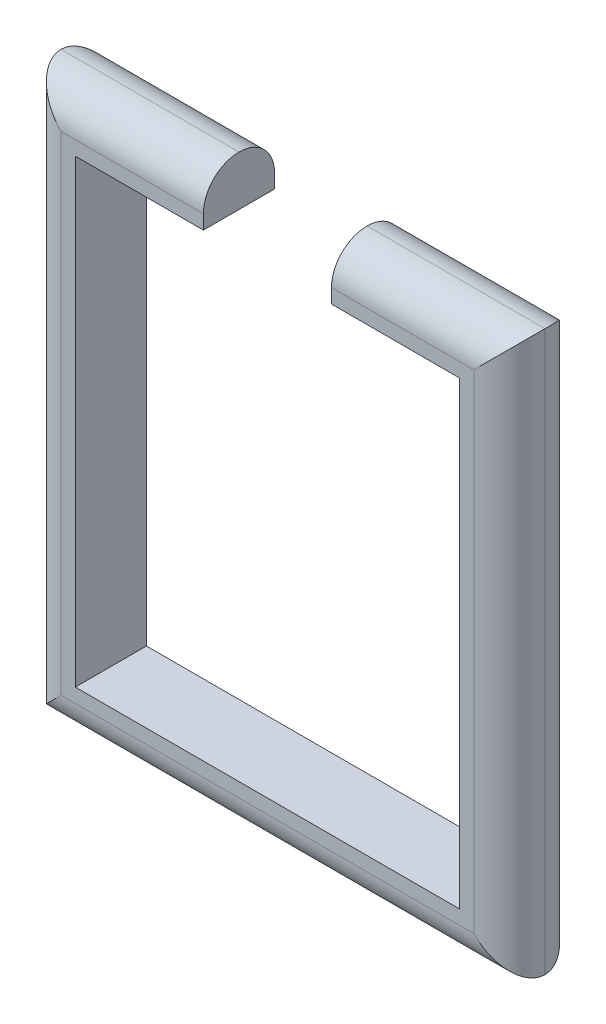
ISO-10303-21;
HEADER;
FILE_DESCRIPTION(('STEP AP214'),'2;1');
FILE_NAME('part.step','',(''),(''),'','','');
FILE_SCHEMA(('AUTOMOTIVE_DESIGN { 1 0 10303 214 1 1 1 1 }'));
ENDSEC;
DATA;
#1=APPLICATION_CONTEXT('core data for automotive mechanical design processes');
#2=APPLICATION_PROTOCOL_DEFINITION('international standard','automotive_design',2000,#1);
#3=PRODUCT_CONTEXT('',#1,'mechanical');
#4=PRODUCT('Part','Part','',(#3));
#5=PRODUCT_RELATED_PRODUCT_CATEGORY('part','',(#4));
#6=PRODUCT_DEFINITION_FORMATION('','',#4);
#7=PRODUCT_DEFINITION_CONTEXT('part definition',#1,'design');
#8=PRODUCT_DEFINITION('design','',#6,#7);
#9=PRODUCT_DEFINITION_SHAPE('','',#8);
#10=(LENGTH_UNIT() NAMED_UNIT(*) SI_UNIT(.MILLI.,.METRE.));
#11=(NAMED_UNIT(*) PLANE_ANGLE_UNIT() SI_UNIT($,.RADIAN.));
#12=(NAMED_UNIT(*) SI_UNIT($,.STERADIAN.) SOLID_ANGLE_UNIT());
#13=UNCERTAINTY_MEASURE_WITH_UNIT(LENGTH_MEASURE(1.E-05),#10,'distance_accuracy_value','');
#14=(GEOMETRIC_REPRESENTATION_CONTEXT(3) GLOBAL_UNCERTAINTY_ASSIGNED_CONTEXT((#13)) GLOBAL_UNIT_ASSIGNED_CONTEXT((#10,
#11,#12)) REPRESENTATION_CONTEXT('',''));
#15=CARTESIAN_POINT('',(0.,0.,0.));
#16=DIRECTION('',(0.,0.,1.));
#17=DIRECTION('',(1.,0.,0.));
#18=AXIS2_PLACEMENT_3D('',#15,#16,#17);
#19=CARTESIAN_POINT('',(144.213164432346,0.,127.));
#20=DIRECTION('',(1.,0.,0.));
#21=DIRECTION('',(0.,0.,-1.));
#22=AXIS2_PLACEMENT_3D('',#19,#20,#21);
#23=PLANE('',#22);
#24=CARTESIAN_POINT('',(144.213164432346,-237.223028831347,63.5));
#25=DIRECTION('',(1.,0.,0.));
#26=DIRECTION('',(0.,0.,-1.));
#27=AXIS2_PLACEMENT_3D('',#24,#25,#26);
#28=CIRCLE('',#27,63.5);
#29=CARTESIAN_POINT('',(144.213164432346,-237.223028831347,127.));
#30=VERTEX_POINT('',#29);
#31=CARTESIAN_POINT('',(144.213164432346,-173.723028831347,63.5));
#32=VERTEX_POINT('',#31);
#33=EDGE_CURVE('E165',#30,#32,#28,.F.);
#34=ORIENTED_EDGE('',*,*,#33,.T.);
#35=CARTESIAN_POINT('',(144.213164432346,-237.223028831347,63.5));
#36=DIRECTION('',(1.,0.,0.));
#37=DIRECTION('',(0.,0.,-1.));
#38=AXIS2_PLACEMENT_3D('',#35,#36,#37);
#39=CIRCLE('',#38,63.5);
#40=CARTESIAN_POINT('',(144.213164432346,-237.223028831347,0.));
#41=VERTEX_POINT('',#40);
#42=EDGE_CURVE('E241',#32,#41,#39,.F.);
#43=ORIENTED_EDGE('',*,*,#42,.T.);
#44=DIRECTION('',(0.,-1.,0.));
#45=VECTOR('',#44,1.);
#46=CARTESIAN_POINT('',(144.213164432346,0.,0.));
#47=LINE('',#46,#45);
#48=CARTESIAN_POINT('',(144.213164432346,-262.623028831347,0.));
#49=VERTEX_POINT('',#48);
#50=EDGE_CURVE('E84',#41,#49,#47,.T.);
#51=ORIENTED_EDGE('',*,*,#50,.T.);
#52=DIRECTION('',(0.,0.,-1.));
#53=VECTOR('',#52,1.);
#54=CARTESIAN_POINT('',(144.213164432346,-262.623028831347,127.));
#55=LINE('',#54,#53);
#56=CARTESIAN_POINT('',(144.213164432346,-262.623028831347,127.));
#57=VERTEX_POINT('',#56);
#58=EDGE_CURVE('E227',#57,#49,#55,.T.);
#59=ORIENTED_EDGE('',*,*,#58,.F.);
#60=DIRECTION('',(0.,-1.,0.));
#61=VECTOR('',#60,1.);
#62=CARTESIAN_POINT('',(144.213164432346,0.,127.));
#63=LINE('',#62,#61);
#64=EDGE_CURVE('E214',#30,#57,#63,.T.);
#65=ORIENTED_EDGE('',*,*,#64,.F.);
#66=EDGE_LOOP('',(#34,#43,#51,#59,#65));
#67=FACE_BOUND('',#66,.T.);
#68=ADVANCED_FACE('F35',(#67),#23,.F.);
#69=CARTESIAN_POINT('',(0.,-262.623028831347,127.));
#70=DIRECTION('',(0.,1.,0.));
#71=DIRECTION('',(0.,0.,1.));
#72=AXIS2_PLACEMENT_3D('',#69,#70,#71);
#73=PLANE('',#72);
#74=DIRECTION('',(1.,0.,0.));
#75=VECTOR('',#74,1.);
#76=CARTESIAN_POINT('',(0.,-262.623028831347,0.));
#77=LINE('',#76,#75);
#78=CARTESIAN_POINT('',(372.813164432346,-262.623028831347,0.));
#79=VERTEX_POINT('',#78);
#80=EDGE_CURVE('E195',#49,#79,#77,.T.);
#81=ORIENTED_EDGE('',*,*,#80,.T.);
#82=DIRECTION('',(0.,0.,-1.));
#83=VECTOR('',#82,1.);
#84=CARTESIAN_POINT('',(372.813164432346,-262.623028831347,127.));
#85=LINE('',#84,#83);
#86=CARTESIAN_POINT('',(372.813164432346,-262.623028831347,127.));
#87=VERTEX_POINT('',#86);
#88=EDGE_CURVE('E224',#87,#79,#85,.T.);
#89=ORIENTED_EDGE('',*,*,#88,.F.);
#90=DIRECTION('',(1.,0.,0.));
#91=VECTOR('',#90,1.);
#92=CARTESIAN_POINT('',(0.,-262.623028831347,127.));
#93=LINE('',#92,#91);
#94=EDGE_CURVE('E282',#57,#87,#93,.T.);
#95=ORIENTED_EDGE('',*,*,#94,.F.);
#96=ORIENTED_EDGE('',*,*,#58,.T.);
#97=EDGE_LOOP('',(#81,#89,#95,#96));
#98=FACE_BOUND('',#97,.T.);
#99=ADVANCED_FACE('F267',(#98),#73,.F.);
#100=CARTESIAN_POINT('',(372.813164432346,0.,127.));
#101=DIRECTION('',(1.,0.,0.));
#102=DIRECTION('',(0.,1.,0.));
#103=AXIS2_PLACEMENT_3D('',#100,#101,#102);
#104=PLANE('',#103);
#105=DIRECTION('',(0.,-1.,0.));
#106=VECTOR('',#105,1.);
#107=CARTESIAN_POINT('',(372.813164432346,0.,0.));
#108=LINE('',#107,#106);
#109=CARTESIAN_POINT('',(372.813164432346,-1083.29702883135,0.));
#110=VERTEX_POINT('',#109);
#111=EDGE_CURVE('E197',#79,#110,#108,.T.);
#112=ORIENTED_EDGE('',*,*,#111,.T.);
#113=DIRECTION('',(0.,0.,-1.));
#114=VECTOR('',#113,1.);
#115=CARTESIAN_POINT('',(372.813164432346,-1083.29702883135,127.));
#116=LINE('',#115,#114);
#117=CARTESIAN_POINT('',(372.813164432346,-1083.29702883135,127.));
#118=VERTEX_POINT('',#117);
#119=EDGE_CURVE('E222',#118,#110,#116,.T.);
#120=ORIENTED_EDGE('',*,*,#119,.F.);
#121=DIRECTION('',(0.,-1.,0.));
#122=VECTOR('',#121,1.);
#123=CARTESIAN_POINT('',(372.813164432346,0.,127.));
#124=LINE('',#123,#122);
#125=EDGE_CURVE('E275',#87,#118,#124,.T.);
#126=ORIENTED_EDGE('',*,*,#125,.F.);
#127=ORIENTED_EDGE('',*,*,#88,.T.);
#128=EDGE_LOOP('',(#112,#120,#126,#127));
#129=FACE_BOUND('',#128,.T.);
#130=ADVANCED_FACE('F272',(#129),#104,.F.);
#131=CARTESIAN_POINT('',(0.,-1083.29702883135,127.));
#132=DIRECTION('',(0.,1.,0.));
#133=DIRECTION('',(0.,0.,1.));
#134=AXIS2_PLACEMENT_3D('',#131,#132,#133);
#135=PLANE('',#134);
#136=DIRECTION('',(1.,0.,0.));
#137=VECTOR('',#136,1.);
#138=CARTESIAN_POINT('',(0.,-1083.29702883135,0.));
#139=LINE('',#138,#137);
#140=CARTESIAN_POINT('',(-312.986835567654,-1083.29702883135,0.));
#141=VERTEX_POINT('',#140);
#142=EDGE_CURVE('E206',#141,#110,#139,.T.);
#143=ORIENTED_EDGE('',*,*,#142,.F.);
#144=DIRECTION('',(0.,0.,-1.));
#145=VECTOR('',#144,1.);
#146=CARTESIAN_POINT('',(-312.986835567654,-1083.29702883135,127.));
#147=LINE('',#146,#145);
#148=CARTESIAN_POINT('',(-312.986835567654,-1083.29702883135,127.));
#149=VERTEX_POINT('',#148);
#150=EDGE_CURVE('E220',#149,#141,#147,.T.);
#151=ORIENTED_EDGE('',*,*,#150,.F.);
#152=DIRECTION('',(1.,0.,0.));
#153=VECTOR('',#152,1.);
#154=CARTESIAN_POINT('',(0.,-1083.29702883135,127.));
#155=LINE('',#154,#153);
#156=EDGE_CURVE('E281',#149,#118,#155,.T.);
#157=ORIENTED_EDGE('',*,*,#156,.T.);
#158=ORIENTED_EDGE('',*,*,#119,.T.);
#159=EDGE_LOOP('',(#143,#151,#157,#158));
#160=FACE_BOUND('',#159,.T.);
#161=ADVANCED_FACE('F426',(#160),#135,.T.);
#162=CARTESIAN_POINT('',(-312.986835567654,0.,127.));
#163=DIRECTION('',(1.,0.,0.));
#164=DIRECTION('',(0.,0.,-1.));
#165=AXIS2_PLACEMENT_3D('',#162,#163,#164);
#166=PLANE('',#165);
#167=DIRECTION('',(0.,-1.,0.));
#168=VECTOR('',#167,1.);
#169=CARTESIAN_POINT('',(-312.986835567654,0.,0.));
#170=LINE('',#169,#168);
#171=CARTESIAN_POINT('',(-312.986835567654,-262.623028831347,0.));
#172=VERTEX_POINT('',#171);
#173=EDGE_CURVE('E209',#172,#141,#170,.T.);
#174=ORIENTED_EDGE('',*,*,#173,.F.);
#175=DIRECTION('',(0.,0.,-1.));
#176=VECTOR('',#175,1.);
#177=CARTESIAN_POINT('',(-312.986835567654,-262.623028831347,127.));
#178=LINE('',#177,#176);
#179=CARTESIAN_POINT('',(-312.986835567654,-262.623028831347,127.));
#180=VERTEX_POINT('',#179);
#181=EDGE_CURVE('E218',#180,#172,#178,.T.);
#182=ORIENTED_EDGE('',*,*,#181,.F.);
#183=DIRECTION('',(0.,-1.,0.));
#184=VECTOR('',#183,1.);
#185=CARTESIAN_POINT('',(-312.986835567654,0.,127.));
#186=LINE('',#185,#184);
#187=EDGE_CURVE('E284',#180,#149,#186,.T.);
#188=ORIENTED_EDGE('',*,*,#187,.T.);
#189=ORIENTED_EDGE('',*,*,#150,.T.);
#190=EDGE_LOOP('',(#174,#182,#188,#189));
#191=FACE_BOUND('',#190,.T.);
#192=ADVANCED_FACE('F418',(#191),#166,.T.);
#193=CARTESIAN_POINT('',(-84.3868355676536,-262.623028831347,0.));
#194=VERTEX_POINT('',#193);
#195=EDGE_CURVE('E199',#172,#194,#77,.T.);
#196=ORIENTED_EDGE('',*,*,#195,.T.);
#197=DIRECTION('',(0.,0.,-1.));
#198=VECTOR('',#197,1.);
#199=CARTESIAN_POINT('',(-84.3868355676536,-262.623028831347,127.));
#200=LINE('',#199,#198);
#201=CARTESIAN_POINT('',(-84.3868355676536,-262.623028831347,127.));
#202=VERTEX_POINT('',#201);
#203=EDGE_CURVE('E215',#202,#194,#200,.T.);
#204=ORIENTED_EDGE('',*,*,#203,.F.);
#205=EDGE_CURVE('E287',#180,#202,#93,.T.);
#206=ORIENTED_EDGE('',*,*,#205,.F.);
#207=ORIENTED_EDGE('',*,*,#181,.T.);
#208=EDGE_LOOP('',(#196,#204,#206,#207));
#209=FACE_BOUND('',#208,.T.);
#210=ADVANCED_FACE('F314',(#209),#73,.F.);
#211=CARTESIAN_POINT('',(-84.3868355676536,0.,127.));
#212=DIRECTION('',(1.,0.,0.));
#213=DIRECTION('',(0.,1.,0.));
#214=AXIS2_PLACEMENT_3D('',#211,#212,#213);
#215=PLANE('',#214);
#216=DIRECTION('',(0.,-1.,0.));
#217=VECTOR('',#216,1.);
#218=CARTESIAN_POINT('',(-84.3868355676536,0.,0.));
#219=LINE('',#218,#217);
#220=CARTESIAN_POINT('',(-84.3868355676536,-237.223028831347,0.));
#221=VERTEX_POINT('',#220);
#222=EDGE_CURVE('E212',#221,#194,#219,.T.);
#223=ORIENTED_EDGE('',*,*,#222,.F.);
#224=CARTESIAN_POINT('',(-84.3868355676536,-237.223028831347,63.5));
#225=DIRECTION('',(1.,0.,0.));
#226=DIRECTION('',(0.,1.,0.));
#227=AXIS2_PLACEMENT_3D('',#224,#225,#226);
#228=CIRCLE('',#227,63.5);
#229=CARTESIAN_POINT('',(-84.3868355676536,-173.723028831347,63.5));
#230=VERTEX_POINT('',#229);
#231=EDGE_CURVE('E11',#221,#230,#228,.T.);
#232=ORIENTED_EDGE('',*,*,#231,.T.);
#233=CARTESIAN_POINT('',(-84.3868355676536,-237.223028831347,63.5));
#234=DIRECTION('',(1.,0.,0.));
#235=DIRECTION('',(0.,1.,0.));
#236=AXIS2_PLACEMENT_3D('',#233,#234,#235);
#237=CIRCLE('',#236,63.5);
#238=CARTESIAN_POINT('',(-84.3868355676536,-237.223028831347,127.));
#239=VERTEX_POINT('',#238);
#240=EDGE_CURVE('E45',#230,#239,#237,.T.);
#241=ORIENTED_EDGE('',*,*,#240,.T.);
#242=DIRECTION('',(0.,-1.,0.));
#243=VECTOR('',#242,1.);
#244=CARTESIAN_POINT('',(-84.3868355676536,0.,127.));
#245=LINE('',#244,#243);
#246=EDGE_CURVE('E201',#239,#202,#245,.T.);
#247=ORIENTED_EDGE('',*,*,#246,.T.);
#248=ORIENTED_EDGE('',*,*,#203,.T.);
#249=EDGE_LOOP('',(#223,#232,#241,#247,#248));
#250=FACE_BOUND('',#249,.T.);
#251=ADVANCED_FACE('F298',(#250),#215,.T.);
#252=CARTESIAN_POINT('',(0.,0.,127.));
#253=DIRECTION('',(0.,0.,1.));
#254=DIRECTION('',(1.,0.,0.));
#255=AXIS2_PLACEMENT_3D('',#252,#253,#254);
#256=PLANE('',#255);
#257=DIRECTION('',(0.,-1.,0.));
#258=VECTOR('',#257,1.);
#259=CARTESIAN_POINT('',(398.213164432346,0.,127.));
#260=LINE('',#259,#258);
#261=CARTESIAN_POINT('',(398.213164432346,-1108.69702883135,127.));
#262=VERTEX_POINT('',#261);
#263=CARTESIAN_POINT('',(398.213164432346,-237.223028831347,127.));
#264=VERTEX_POINT('',#263);
#265=EDGE_CURVE('E138',#262,#264,#260,.F.);
#266=ORIENTED_EDGE('',*,*,#265,.T.);
#267=DIRECTION('',(1.,0.,0.));
#268=VECTOR('',#267,1.);
#269=CARTESIAN_POINT('',(0.,-237.223028831347,127.));
#270=LINE('',#269,#268);
#271=EDGE_CURVE('E143',#264,#30,#270,.F.);
#272=ORIENTED_EDGE('',*,*,#271,.T.);
#273=ORIENTED_EDGE('',*,*,#64,.T.);
#274=ORIENTED_EDGE('',*,*,#94,.T.);
#275=ORIENTED_EDGE('',*,*,#125,.T.);
#276=ORIENTED_EDGE('',*,*,#156,.F.);
#277=ORIENTED_EDGE('',*,*,#187,.F.);
#278=ORIENTED_EDGE('',*,*,#205,.T.);
#279=ORIENTED_EDGE('',*,*,#246,.F.);
#280=DIRECTION('',(1.,0.,0.));
#281=VECTOR('',#280,1.);
#282=CARTESIAN_POINT('',(0.,-237.223028831347,127.));
#283=LINE('',#282,#281);
#284=CARTESIAN_POINT('',(-338.386835567654,-237.223028831347,127.));
#285=VERTEX_POINT('',#284);
#286=EDGE_CURVE('E166',#239,#285,#283,.F.);
#287=ORIENTED_EDGE('',*,*,#286,.T.);
#288=DIRECTION('',(0.,-1.,0.));
#289=VECTOR('',#288,1.);
#290=CARTESIAN_POINT('',(-338.386835567653,-1172.19702883135,127.));
#291=LINE('',#290,#289);
#292=CARTESIAN_POINT('',(-338.386835567653,-1108.69702883135,127.));
#293=VERTEX_POINT('',#292);
#294=EDGE_CURVE('E150',#285,#293,#291,.T.);
#295=ORIENTED_EDGE('',*,*,#294,.T.);
#296=DIRECTION('',(1.,0.,0.));
#297=VECTOR('',#296,1.);
#298=CARTESIAN_POINT('',(461.713164432346,-1108.69702883135,127.));
#299=LINE('',#298,#297);
#300=EDGE_CURVE('E146',#293,#262,#299,.T.);
#301=ORIENTED_EDGE('',*,*,#300,.T.);
#302=EDGE_LOOP('',(#266,#272,#273,#274,#275,#276,#277,#278,#279,#287,#295,#301));
#303=FACE_BOUND('',#302,.T.);
#304=ADVANCED_FACE('F140',(#303),#256,.T.);
#305=CARTESIAN_POINT('',(0.,0.,0.));
#306=DIRECTION('',(0.,0.,1.));
#307=DIRECTION('',(1.,0.,0.));
#308=AXIS2_PLACEMENT_3D('',#305,#306,#307);
#309=PLANE('',#308);
#310=ORIENTED_EDGE('',*,*,#50,.F.);
#311=DIRECTION('',(1.,0.,0.));
#312=VECTOR('',#311,1.);
#313=CARTESIAN_POINT('',(461.713164432346,-237.223028831347,0.));
#314=LINE('',#313,#312);
#315=CARTESIAN_POINT('',(398.213164432346,-237.223028831347,0.));
#316=VERTEX_POINT('',#315);
#317=EDGE_CURVE('E237',#41,#316,#314,.T.);
#318=ORIENTED_EDGE('',*,*,#317,.T.);
#319=DIRECTION('',(0.,-1.,0.));
#320=VECTOR('',#319,1.);
#321=CARTESIAN_POINT('',(398.213164432346,-1172.19702883135,0.));
#322=LINE('',#321,#320);
#323=CARTESIAN_POINT('',(398.213164432346,-1108.69702883135,0.));
#324=VERTEX_POINT('',#323);
#325=EDGE_CURVE('E231',#316,#324,#322,.T.);
#326=ORIENTED_EDGE('',*,*,#325,.T.);
#327=DIRECTION('',(1.,0.,0.));
#328=VECTOR('',#327,1.);
#329=CARTESIAN_POINT('',(0.,-1108.69702883135,0.));
#330=LINE('',#329,#328);
#331=CARTESIAN_POINT('',(-338.386835567653,-1108.69702883135,0.));
#332=VERTEX_POINT('',#331);
#333=EDGE_CURVE('E229',#324,#332,#330,.F.);
#334=ORIENTED_EDGE('',*,*,#333,.T.);
#335=DIRECTION('',(0.,-1.,0.));
#336=VECTOR('',#335,1.);
#337=CARTESIAN_POINT('',(-338.386835567654,0.,0.));
#338=LINE('',#337,#336);
#339=CARTESIAN_POINT('',(-338.386835567654,-237.223028831347,0.));
#340=VERTEX_POINT('',#339);
#341=EDGE_CURVE('E233',#332,#340,#338,.F.);
#342=ORIENTED_EDGE('',*,*,#341,.T.);
#343=DIRECTION('',(1.,0.,0.));
#344=VECTOR('',#343,1.);
#345=CARTESIAN_POINT('',(-84.3868355676536,-237.223028831347,0.));
#346=LINE('',#345,#344);
#347=EDGE_CURVE('E235',#340,#221,#346,.T.);
#348=ORIENTED_EDGE('',*,*,#347,.T.);
#349=ORIENTED_EDGE('',*,*,#222,.T.);
#350=ORIENTED_EDGE('',*,*,#195,.F.);
#351=ORIENTED_EDGE('',*,*,#173,.T.);
#352=ORIENTED_EDGE('',*,*,#142,.T.);
#353=ORIENTED_EDGE('',*,*,#111,.F.);
#354=ORIENTED_EDGE('',*,*,#80,.F.);
#355=EDGE_LOOP('',(#310,#318,#326,#334,#342,#348,#349,#350,#351,#352,#353,#354));
#356=FACE_BOUND('',#355,.T.);
#357=ADVANCED_FACE('F263',(#356),#309,.F.);
#358=CARTESIAN_POINT('',(0.,-237.223028831347,63.5));
#359=DIRECTION('',(1.,0.,0.));
#360=DIRECTION('',(0.,0.,-1.));
#361=AXIS2_PLACEMENT_3D('',#358,#359,#360);
#362=CYLINDRICAL_SURFACE('',#361,63.5);
#363=ORIENTED_EDGE('',*,*,#286,.F.);
#364=ORIENTED_EDGE('',*,*,#240,.F.);
#365=DIRECTION('',(1.,0.,0.));
#366=VECTOR('',#365,1.);
#367=CARTESIAN_POINT('',(0.,-173.723028831347,63.5));
#368=LINE('',#367,#366);
#369=CARTESIAN_POINT('',(-401.886835567654,-173.723028831347,63.5));
#370=VERTEX_POINT('',#369);
#371=EDGE_CURVE('E39',#370,#230,#368,.T.);
#372=ORIENTED_EDGE('',*,*,#371,.F.);
#373=CARTESIAN_POINT('',(-338.386835567654,-237.223028831347,63.5));
#374=DIRECTION('',(0.707106781186547,0.707106781186548,0.));
#375=DIRECTION('',(-0.707106781186548,0.707106781186547,0.));
#376=AXIS2_PLACEMENT_3D('',#373,#374,#375);
#377=ELLIPSE('',#376,89.8025612106916,63.5);
#378=EDGE_CURVE('E191',#285,#370,#377,.F.);
#379=ORIENTED_EDGE('',*,*,#378,.F.);
#380=EDGE_LOOP('',(#363,#364,#372,#379));
#381=FACE_BOUND('',#380,.T.);
#382=ADVANCED_FACE('F37',(#381),#362,.T.);
#383=CARTESIAN_POINT('',(0.,-237.223028831347,63.5));
#384=DIRECTION('',(-1.,0.,0.));
#385=DIRECTION('',(0.,0.,1.));
#386=AXIS2_PLACEMENT_3D('',#383,#384,#385);
#387=CYLINDRICAL_SURFACE('',#386,63.5);
#388=ORIENTED_EDGE('',*,*,#231,.F.);
#389=ORIENTED_EDGE('',*,*,#347,.F.);
#390=CARTESIAN_POINT('',(-338.386835567654,-237.223028831347,63.5));
#391=DIRECTION('',(-0.707106781186547,-0.707106781186548,0.));
#392=DIRECTION('',(0.707106781186548,-0.707106781186547,0.));
#393=AXIS2_PLACEMENT_3D('',#390,#391,#392);
#394=ELLIPSE('',#393,89.8025612106916,63.5);
#395=EDGE_CURVE('E189',#370,#340,#394,.T.);
#396=ORIENTED_EDGE('',*,*,#395,.F.);
#397=ORIENTED_EDGE('',*,*,#371,.T.);
#398=EDGE_LOOP('',(#388,#389,#396,#397));
#399=FACE_BOUND('',#398,.T.);
#400=ADVANCED_FACE('F302',(#399),#387,.T.);
#401=CARTESIAN_POINT('',(-338.386835567654,0.,63.5));
#402=DIRECTION('',(0.,1.,0.));
#403=DIRECTION('',(-1.,0.,0.));
#404=AXIS2_PLACEMENT_3D('',#401,#402,#403);
#405=CYLINDRICAL_SURFACE('',#404,63.5);
#406=ORIENTED_EDGE('',*,*,#294,.F.);
#407=ORIENTED_EDGE('',*,*,#378,.T.);
#408=DIRECTION('',(0.,-1.,0.));
#409=VECTOR('',#408,1.);
#410=CARTESIAN_POINT('',(-401.886835567654,-173.723028831347,63.5));
#411=LINE('',#410,#409);
#412=CARTESIAN_POINT('',(-401.886835567653,-1172.19702883135,63.5));
#413=VERTEX_POINT('',#412);
#414=EDGE_CURVE('E70',#413,#370,#411,.F.);
#415=ORIENTED_EDGE('',*,*,#414,.F.);
#416=CARTESIAN_POINT('',(-338.386835567654,-1108.69702883135,63.5));
#417=DIRECTION('',(-0.707106781186548,0.707106781186547,0.));
#418=DIRECTION('',(-0.707106781186547,-0.707106781186548,0.));
#419=AXIS2_PLACEMENT_3D('',#416,#417,#418);
#420=ELLIPSE('',#419,89.8025612106915,63.5);
#421=EDGE_CURVE('E186',#293,#413,#420,.F.);
#422=ORIENTED_EDGE('',*,*,#421,.F.);
#423=EDGE_LOOP('',(#406,#407,#415,#422));
#424=FACE_BOUND('',#423,.T.);
#425=ADVANCED_FACE('F245',(#424),#405,.T.);
#426=CARTESIAN_POINT('',(-338.386835567654,0.,63.5));
#427=DIRECTION('',(0.,-1.,0.));
#428=DIRECTION('',(1.,0.,0.));
#429=AXIS2_PLACEMENT_3D('',#426,#427,#428);
#430=CYLINDRICAL_SURFACE('',#429,63.5);
#431=ORIENTED_EDGE('',*,*,#395,.T.);
#432=ORIENTED_EDGE('',*,*,#341,.F.);
#433=CARTESIAN_POINT('',(-338.386835567654,-1108.69702883135,63.5));
#434=DIRECTION('',(0.707106781186548,-0.707106781186547,0.));
#435=DIRECTION('',(0.707106781186547,0.707106781186548,0.));
#436=AXIS2_PLACEMENT_3D('',#433,#434,#435);
#437=ELLIPSE('',#436,89.8025612106915,63.5);
#438=EDGE_CURVE('E183',#413,#332,#437,.T.);
#439=ORIENTED_EDGE('',*,*,#438,.F.);
#440=ORIENTED_EDGE('',*,*,#414,.T.);
#441=EDGE_LOOP('',(#431,#432,#439,#440));
#442=FACE_BOUND('',#441,.T.);
#443=ADVANCED_FACE('F330',(#442),#430,.T.);
#444=CARTESIAN_POINT('',(0.,-1108.69702883135,63.5));
#445=DIRECTION('',(-1.,0.,0.));
#446=DIRECTION('',(0.,0.,1.));
#447=AXIS2_PLACEMENT_3D('',#444,#445,#446);
#448=CYLINDRICAL_SURFACE('',#447,63.5);
#449=ORIENTED_EDGE('',*,*,#300,.F.);
#450=ORIENTED_EDGE('',*,*,#421,.T.);
#451=DIRECTION('',(1.,0.,0.));
#452=VECTOR('',#451,1.);
#453=CARTESIAN_POINT('',(-401.886835567653,-1172.19702883135,63.5));
#454=LINE('',#453,#452);
#455=CARTESIAN_POINT('',(461.713164432346,-1172.19702883135,63.5));
#456=VERTEX_POINT('',#455);
#457=EDGE_CURVE('E180',#456,#413,#454,.F.);
#458=ORIENTED_EDGE('',*,*,#457,.F.);
#459=CARTESIAN_POINT('',(398.213164432346,-1108.69702883135,63.5));
#460=DIRECTION('',(-0.707106781186547,-0.707106781186548,0.));
#461=DIRECTION('',(-0.707106781186547,0.707106781186547,0.));
#462=AXIS2_PLACEMENT_3D('',#459,#460,#461);
#463=ELLIPSE('',#462,89.8025612106916,63.5);
#464=EDGE_CURVE('E160',#262,#456,#463,.F.);
#465=ORIENTED_EDGE('',*,*,#464,.F.);
#466=EDGE_LOOP('',(#449,#450,#458,#465));
#467=FACE_BOUND('',#466,.T.);
#468=ADVANCED_FACE('F248',(#467),#448,.T.);
#469=CARTESIAN_POINT('',(0.,-1108.69702883135,63.5));
#470=DIRECTION('',(1.,0.,0.));
#471=DIRECTION('',(0.,0.,-1.));
#472=AXIS2_PLACEMENT_3D('',#469,#470,#471);
#473=CYLINDRICAL_SURFACE('',#472,63.5);
#474=ORIENTED_EDGE('',*,*,#438,.T.);
#475=ORIENTED_EDGE('',*,*,#333,.F.);
#476=CARTESIAN_POINT('',(398.213164432346,-1108.69702883135,63.5));
#477=DIRECTION('',(0.707106781186547,0.707106781186548,0.));
#478=DIRECTION('',(0.707106781186547,-0.707106781186547,0.));
#479=AXIS2_PLACEMENT_3D('',#476,#477,#478);
#480=ELLIPSE('',#479,89.8025612106916,63.5);
#481=EDGE_CURVE('E161',#456,#324,#480,.T.);
#482=ORIENTED_EDGE('',*,*,#481,.F.);
#483=ORIENTED_EDGE('',*,*,#457,.T.);
#484=EDGE_LOOP('',(#474,#475,#482,#483));
#485=FACE_BOUND('',#484,.T.);
#486=ADVANCED_FACE('F252',(#485),#473,.T.);
#487=CARTESIAN_POINT('',(398.213164432346,0.,63.5));
#488=DIRECTION('',(0.,-1.,0.));
#489=DIRECTION('',(1.,0.,0.));
#490=AXIS2_PLACEMENT_3D('',#487,#488,#489);
#491=CYLINDRICAL_SURFACE('',#490,63.5);
#492=CARTESIAN_POINT('',(398.213164432346,-237.223028831347,63.5));
#493=DIRECTION('',(0.707106781186547,-0.707106781186547,0.));
#494=DIRECTION('',(-0.707106781186547,-0.707106781186548,0.));
#495=AXIS2_PLACEMENT_3D('',#492,#493,#494);
#496=ELLIPSE('',#495,89.8025612106915,63.5);
#497=CARTESIAN_POINT('',(461.713164432346,-173.723028831347,63.5));
#498=VERTEX_POINT('',#497);
#499=EDGE_CURVE('E153',#264,#498,#496,.F.);
#500=ORIENTED_EDGE('',*,*,#499,.F.);
#501=ORIENTED_EDGE('',*,*,#265,.F.);
#502=ORIENTED_EDGE('',*,*,#464,.T.);
#503=DIRECTION('',(0.,-1.,0.));
#504=VECTOR('',#503,1.);
#505=CARTESIAN_POINT('',(461.713164432346,0.,63.5));
#506=LINE('',#505,#504);
#507=EDGE_CURVE('E156',#498,#456,#506,.T.);
#508=ORIENTED_EDGE('',*,*,#507,.F.);
#509=EDGE_LOOP('',(#500,#501,#502,#508));
#510=FACE_BOUND('',#509,.T.);
#511=ADVANCED_FACE('F154',(#510),#491,.T.);
#512=CARTESIAN_POINT('',(0.,-237.223028831347,63.5));
#513=DIRECTION('',(1.,0.,0.));
#514=DIRECTION('',(0.,0.,-1.));
#515=AXIS2_PLACEMENT_3D('',#512,#513,#514);
#516=CYLINDRICAL_SURFACE('',#515,63.5);
#517=ORIENTED_EDGE('',*,*,#271,.F.);
#518=ORIENTED_EDGE('',*,*,#499,.T.);
#519=DIRECTION('',(1.,0.,0.));
#520=VECTOR('',#519,1.);
#521=CARTESIAN_POINT('',(0.,-173.723028831347,63.5));
#522=LINE('',#521,#520);
#523=EDGE_CURVE('E174',#32,#498,#522,.T.);
#524=ORIENTED_EDGE('',*,*,#523,.F.);
#525=ORIENTED_EDGE('',*,*,#33,.F.);
#526=EDGE_LOOP('',(#517,#518,#524,#525));
#527=FACE_BOUND('',#526,.T.);
#528=ADVANCED_FACE('F164',(#527),#516,.T.);
#529=CARTESIAN_POINT('',(398.213164432346,0.,63.5));
#530=DIRECTION('',(0.,1.,0.));
#531=DIRECTION('',(-1.,0.,0.));
#532=AXIS2_PLACEMENT_3D('',#529,#530,#531);
#533=CYLINDRICAL_SURFACE('',#532,63.5);
#534=ORIENTED_EDGE('',*,*,#481,.T.);
#535=ORIENTED_EDGE('',*,*,#325,.F.);
#536=CARTESIAN_POINT('',(398.213164432346,-237.223028831347,63.5));
#537=DIRECTION('',(-0.707106781186547,0.707106781186547,0.));
#538=DIRECTION('',(0.707106781186547,0.707106781186548,0.));
#539=AXIS2_PLACEMENT_3D('',#536,#537,#538);
#540=ELLIPSE('',#539,89.8025612106915,63.5);
#541=EDGE_CURVE('E172',#498,#316,#540,.T.);
#542=ORIENTED_EDGE('',*,*,#541,.F.);
#543=ORIENTED_EDGE('',*,*,#507,.T.);
#544=EDGE_LOOP('',(#534,#535,#542,#543));
#545=FACE_BOUND('',#544,.T.);
#546=ADVANCED_FACE('F256',(#545),#533,.T.);
#547=CARTESIAN_POINT('',(0.,-237.223028831347,63.5));
#548=DIRECTION('',(-1.,0.,0.));
#549=DIRECTION('',(0.,0.,1.));
#550=AXIS2_PLACEMENT_3D('',#547,#548,#549);
#551=CYLINDRICAL_SURFACE('',#550,63.5);
#552=ORIENTED_EDGE('',*,*,#42,.F.);
#553=ORIENTED_EDGE('',*,*,#523,.T.);
#554=ORIENTED_EDGE('',*,*,#541,.T.);
#555=ORIENTED_EDGE('',*,*,#317,.F.);
#556=EDGE_LOOP('',(#552,#553,#554,#555));
#557=FACE_BOUND('',#556,.T.);
#558=ADVANCED_FACE('F260',(#557),#551,.T.);
#559=CLOSED_SHELL('',(#68,#99,#130,#161,#192,#210,#251,#304,#357,#382,#400,#425,#443,#468,#486,
#511,#528,#546,#558));
#560=MANIFOLD_SOLID_BREP('B2',#559);
#561=ADVANCED_BREP_SHAPE_REPRESENTATION('',(#18,#560),#14);
#562=SHAPE_DEFINITION_REPRESENTATION(#9,#561);
ENDSEC;
END-ISO-10303-21;
